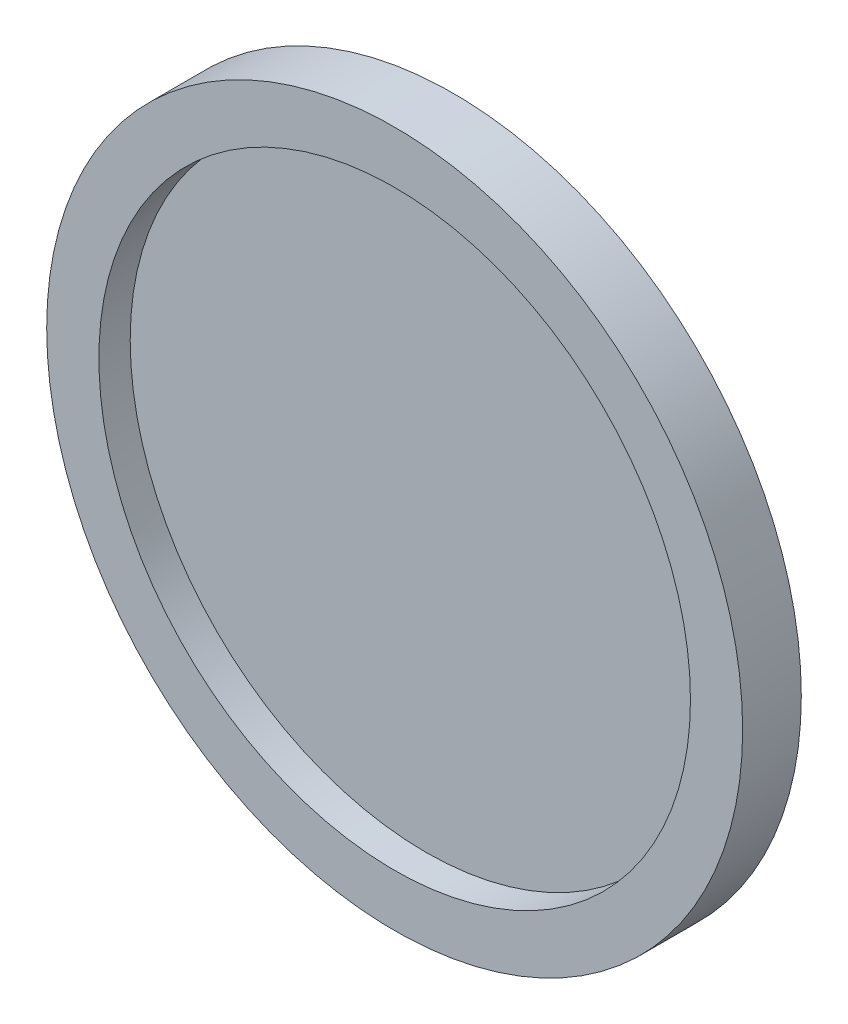
ISO-10303-21;
HEADER;
FILE_DESCRIPTION(('STEP AP214'),'2;1');
FILE_NAME('part.step','',(''),(''),'','','');
FILE_SCHEMA(('AUTOMOTIVE_DESIGN { 1 0 10303 214 1 1 1 1 }'));
ENDSEC;
DATA;
#1=APPLICATION_CONTEXT('core data for automotive mechanical design processes');
#2=APPLICATION_PROTOCOL_DEFINITION('international standard','automotive_design',2000,#1);
#3=PRODUCT_CONTEXT('',#1,'mechanical');
#4=PRODUCT('Part','Part','',(#3));
#5=PRODUCT_RELATED_PRODUCT_CATEGORY('part','',(#4));
#6=PRODUCT_DEFINITION_FORMATION('','',#4);
#7=PRODUCT_DEFINITION_CONTEXT('part definition',#1,'design');
#8=PRODUCT_DEFINITION('design','',#6,#7);
#9=PRODUCT_DEFINITION_SHAPE('','',#8);
#10=(LENGTH_UNIT() NAMED_UNIT(*) SI_UNIT(.MILLI.,.METRE.));
#11=(NAMED_UNIT(*) PLANE_ANGLE_UNIT() SI_UNIT($,.RADIAN.));
#12=(NAMED_UNIT(*) SI_UNIT($,.STERADIAN.) SOLID_ANGLE_UNIT());
#13=UNCERTAINTY_MEASURE_WITH_UNIT(LENGTH_MEASURE(1.E-05),#10,'distance_accuracy_value','');
#14=(GEOMETRIC_REPRESENTATION_CONTEXT(3) GLOBAL_UNCERTAINTY_ASSIGNED_CONTEXT((#13)) GLOBAL_UNIT_ASSIGNED_CONTEXT((#10,
#11,#12)) REPRESENTATION_CONTEXT('',''));
#15=CARTESIAN_POINT('',(0.,0.,0.));
#16=DIRECTION('',(0.,0.,1.));
#17=DIRECTION('',(1.,0.,0.));
#18=AXIS2_PLACEMENT_3D('',#15,#16,#17);
#19=CARTESIAN_POINT('',(0.,0.,1034.44949366117));
#20=DIRECTION('',(0.,0.,-1.));
#21=DIRECTION('',(1.,0.,0.));
#22=AXIS2_PLACEMENT_3D('',#19,#20,#21);
#23=CYLINDRICAL_SURFACE('',#22,297.5);
#24=CARTESIAN_POINT('',(0.,0.,13.));
#25=DIRECTION('',(0.,0.,-1.));
#26=DIRECTION('',(-1.,0.,0.));
#27=AXIS2_PLACEMENT_3D('',#24,#25,#26);
#28=CIRCLE('',#27,297.5);
#29=CARTESIAN_POINT('',(-297.5,0.,13.));
#30=VERTEX_POINT('',#29);
#31=EDGE_CURVE('E10',#30,#30,#28,.T.);
#32=ORIENTED_EDGE('',*,*,#31,.T.);
#33=EDGE_LOOP('',(#32));
#34=FACE_BOUND('',#33,.T.);
#35=CARTESIAN_POINT('',(0.,0.,44.5));
#36=DIRECTION('',(0.,0.,1.));
#37=DIRECTION('',(1.,0.,0.));
#38=AXIS2_PLACEMENT_3D('',#35,#36,#37);
#39=CIRCLE('',#38,297.5);
#40=CARTESIAN_POINT('',(297.5,0.,44.5));
#41=VERTEX_POINT('',#40);
#42=EDGE_CURVE('E25',#41,#41,#39,.T.);
#43=ORIENTED_EDGE('',*,*,#42,.T.);
#44=EDGE_LOOP('',(#43));
#45=FACE_BOUND('',#44,.T.);
#46=ADVANCED_FACE('F14',(#34,#45),#23,.F.);
#47=CARTESIAN_POINT('',(0.,0.,44.5));
#48=DIRECTION('',(0.,0.,-1.));
#49=DIRECTION('',(1.,0.,0.));
#50=AXIS2_PLACEMENT_3D('',#47,#48,#49);
#51=PLANE('',#50);
#52=ORIENTED_EDGE('',*,*,#42,.F.);
#53=EDGE_LOOP('',(#52));
#54=FACE_BOUND('',#53,.T.);
#55=CARTESIAN_POINT('',(0.,0.,44.5));
#56=DIRECTION('',(0.,0.,1.));
#57=DIRECTION('',(1.,0.,0.));
#58=AXIS2_PLACEMENT_3D('',#55,#56,#57);
#59=CIRCLE('',#58,350.);
#60=CARTESIAN_POINT('',(350.,0.,44.5));
#61=VERTEX_POINT('',#60);
#62=EDGE_CURVE('E29',#61,#61,#59,.T.);
#63=ORIENTED_EDGE('',*,*,#62,.T.);
#64=EDGE_LOOP('',(#63));
#65=FACE_BOUND('',#64,.T.);
#66=ADVANCED_FACE('F35',(#54,#65),#51,.F.);
#67=CARTESIAN_POINT('',(0.,0.,-14.5));
#68=DIRECTION('',(0.,0.,-1.));
#69=DIRECTION('',(1.,0.,0.));
#70=AXIS2_PLACEMENT_3D('',#67,#68,#69);
#71=PLANE('',#70);
#72=CARTESIAN_POINT('',(0.,0.,-14.5));
#73=DIRECTION('',(0.,0.,1.));
#74=DIRECTION('',(1.,0.,0.));
#75=AXIS2_PLACEMENT_3D('',#72,#73,#74);
#76=CIRCLE('',#75,350.);
#77=CARTESIAN_POINT('',(350.,0.,-14.5));
#78=VERTEX_POINT('',#77);
#79=EDGE_CURVE('E21',#78,#78,#76,.T.);
#80=ORIENTED_EDGE('',*,*,#79,.F.);
#81=EDGE_LOOP('',(#80));
#82=FACE_BOUND('',#81,.T.);
#83=ADVANCED_FACE('F39',(#82),#71,.T.);
#84=CARTESIAN_POINT('',(0.,0.,-14.5));
#85=DIRECTION('',(0.,0.,1.));
#86=DIRECTION('',(-1.,0.,0.));
#87=AXIS2_PLACEMENT_3D('',#84,#85,#86);
#88=CYLINDRICAL_SURFACE('',#87,350.);
#89=ORIENTED_EDGE('',*,*,#79,.T.);
#90=EDGE_LOOP('',(#89));
#91=FACE_BOUND('',#90,.T.);
#92=ORIENTED_EDGE('',*,*,#62,.F.);
#93=EDGE_LOOP('',(#92));
#94=FACE_BOUND('',#93,.T.);
#95=ADVANCED_FACE('F16',(#91,#94),#88,.T.);
#96=CARTESIAN_POINT('',(0.,0.,13.));
#97=DIRECTION('',(0.,0.,1.));
#98=DIRECTION('',(-1.,0.,0.));
#99=AXIS2_PLACEMENT_3D('',#96,#97,#98);
#100=PLANE('',#99);
#101=ORIENTED_EDGE('',*,*,#31,.F.);
#102=EDGE_LOOP('',(#101));
#103=FACE_BOUND('',#102,.T.);
#104=ADVANCED_FACE('F38',(#103),#100,.T.);
#105=CLOSED_SHELL('',(#46,#66,#83,#95,#104));
#106=MANIFOLD_SOLID_BREP('B1',#105);
#107=ADVANCED_BREP_SHAPE_REPRESENTATION('',(#18,#106),#14);
#108=SHAPE_DEFINITION_REPRESENTATION(#9,#107);
ENDSEC;
END-ISO-10303-21;
